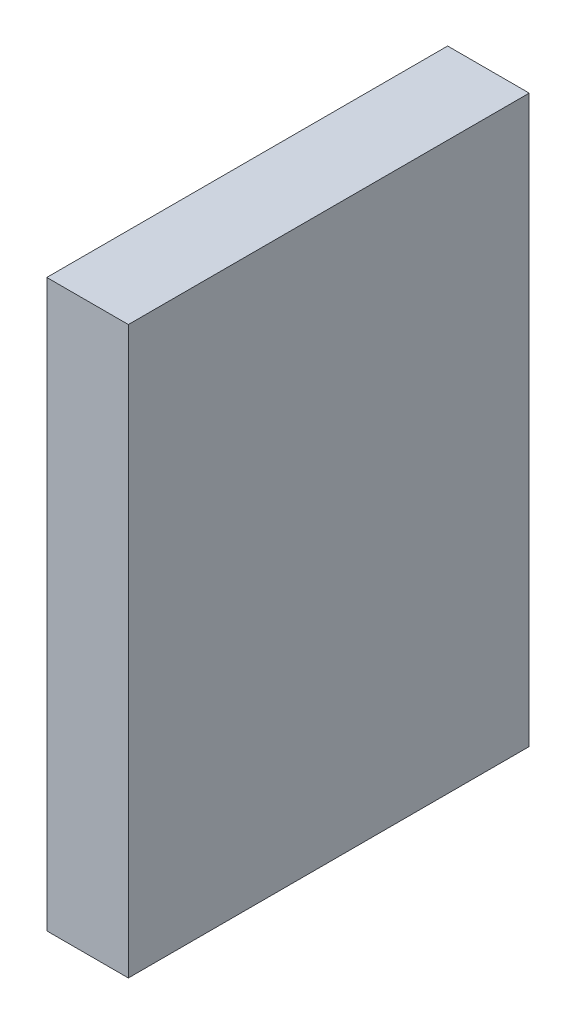
ISO-10303-21;
HEADER;
FILE_DESCRIPTION(('STEP AP214'),'2;1');
FILE_NAME('part.step','',(''),(''),'','','');
FILE_SCHEMA(('AUTOMOTIVE_DESIGN { 1 0 10303 214 1 1 1 1 }'));
ENDSEC;
DATA;
#1=APPLICATION_CONTEXT('core data for automotive mechanical design processes');
#2=APPLICATION_PROTOCOL_DEFINITION('international standard','automotive_design',2000,#1);
#3=PRODUCT_CONTEXT('',#1,'mechanical');
#4=PRODUCT('Part','Part','',(#3));
#5=PRODUCT_RELATED_PRODUCT_CATEGORY('part','',(#4));
#6=PRODUCT_DEFINITION_FORMATION('','',#4);
#7=PRODUCT_DEFINITION_CONTEXT('part definition',#1,'design');
#8=PRODUCT_DEFINITION('design','',#6,#7);
#9=PRODUCT_DEFINITION_SHAPE('','',#8);
#10=(LENGTH_UNIT() NAMED_UNIT(*) SI_UNIT(.MILLI.,.METRE.));
#11=(NAMED_UNIT(*) PLANE_ANGLE_UNIT() SI_UNIT($,.RADIAN.));
#12=(NAMED_UNIT(*) SI_UNIT($,.STERADIAN.) SOLID_ANGLE_UNIT());
#13=UNCERTAINTY_MEASURE_WITH_UNIT(LENGTH_MEASURE(1.E-05),#10,'distance_accuracy_value','');
#14=(GEOMETRIC_REPRESENTATION_CONTEXT(3) GLOBAL_UNCERTAINTY_ASSIGNED_CONTEXT((#13)) GLOBAL_UNIT_ASSIGNED_CONTEXT((#10,
#11,#12)) REPRESENTATION_CONTEXT('',''));
#15=CARTESIAN_POINT('',(0.,0.,0.));
#16=DIRECTION('',(0.,0.,1.));
#17=DIRECTION('',(1.,0.,0.));
#18=AXIS2_PLACEMENT_3D('',#15,#16,#17);
#19=CARTESIAN_POINT('',(43.942,186.055,101.144456521739));
#20=DIRECTION('',(0.,0.,-1.));
#21=DIRECTION('',(0.,1.,0.));
#22=AXIS2_PLACEMENT_3D('',#19,#20,#21);
#23=PLANE('',#22);
#24=DIRECTION('',(0.,-1.,0.));
#25=VECTOR('',#24,1.);
#26=CARTESIAN_POINT('',(0.,186.055,101.144456521739));
#27=LINE('',#26,#25);
#28=CARTESIAN_POINT('',(0.,186.055,101.144456521739));
#29=VERTEX_POINT('',#28);
#30=CARTESIAN_POINT('',(0.,-118.745,101.144456521739));
#31=VERTEX_POINT('',#30);
#32=EDGE_CURVE('E107',#29,#31,#27,.T.);
#33=ORIENTED_EDGE('',*,*,#32,.T.);
#34=DIRECTION('',(-1.,0.,0.));
#35=VECTOR('',#34,1.);
#36=CARTESIAN_POINT('',(43.942,-118.745,101.144456521739));
#37=LINE('',#36,#35);
#38=CARTESIAN_POINT('',(43.942,-118.745,101.144456521739));
#39=VERTEX_POINT('',#38);
#40=EDGE_CURVE('E11',#39,#31,#37,.T.);
#41=ORIENTED_EDGE('',*,*,#40,.F.);
#42=DIRECTION('',(0.,-1.,0.));
#43=VECTOR('',#42,1.);
#44=CARTESIAN_POINT('',(43.942,186.055,101.144456521739));
#45=LINE('',#44,#43);
#46=CARTESIAN_POINT('',(43.942,186.055,101.144456521739));
#47=VERTEX_POINT('',#46);
#48=EDGE_CURVE('E91',#47,#39,#45,.T.);
#49=ORIENTED_EDGE('',*,*,#48,.F.);
#50=DIRECTION('',(-1.,0.,0.));
#51=VECTOR('',#50,1.);
#52=CARTESIAN_POINT('',(43.942,186.055,101.144456521739));
#53=LINE('',#52,#51);
#54=EDGE_CURVE('E103',#47,#29,#53,.T.);
#55=ORIENTED_EDGE('',*,*,#54,.T.);
#56=EDGE_LOOP('',(#33,#41,#49,#55));
#57=FACE_BOUND('',#56,.T.);
#58=ADVANCED_FACE('F39',(#57),#23,.F.);
#59=CARTESIAN_POINT('',(43.942,-118.745,101.144456521739));
#60=DIRECTION('',(0.,1.,0.));
#61=DIRECTION('',(0.,0.,1.));
#62=AXIS2_PLACEMENT_3D('',#59,#60,#61);
#63=PLANE('',#62);
#64=DIRECTION('',(0.,0.,-1.));
#65=VECTOR('',#64,1.);
#66=CARTESIAN_POINT('',(0.,-118.745,101.144456521739));
#67=LINE('',#66,#65);
#68=CARTESIAN_POINT('',(0.,-118.745,-114.755543478261));
#69=VERTEX_POINT('',#68);
#70=EDGE_CURVE('E96',#31,#69,#67,.T.);
#71=ORIENTED_EDGE('',*,*,#70,.T.);
#72=DIRECTION('',(-1.,0.,0.));
#73=VECTOR('',#72,1.);
#74=CARTESIAN_POINT('',(43.942,-118.745,-114.755543478261));
#75=LINE('',#74,#73);
#76=CARTESIAN_POINT('',(43.942,-118.745,-114.755543478261));
#77=VERTEX_POINT('',#76);
#78=EDGE_CURVE('E48',#77,#69,#75,.T.);
#79=ORIENTED_EDGE('',*,*,#78,.F.);
#80=DIRECTION('',(0.,0.,-1.));
#81=VECTOR('',#80,1.);
#82=CARTESIAN_POINT('',(43.942,-118.745,101.144456521739));
#83=LINE('',#82,#81);
#84=EDGE_CURVE('E86',#39,#77,#83,.T.);
#85=ORIENTED_EDGE('',*,*,#84,.F.);
#86=ORIENTED_EDGE('',*,*,#40,.T.);
#87=EDGE_LOOP('',(#71,#79,#85,#86));
#88=FACE_BOUND('',#87,.T.);
#89=ADVANCED_FACE('F95',(#88),#63,.F.);
#90=CARTESIAN_POINT('',(43.942,186.055,-114.755543478261));
#91=DIRECTION('',(0.,0.,1.));
#92=DIRECTION('',(0.,-1.,0.));
#93=AXIS2_PLACEMENT_3D('',#90,#91,#92);
#94=PLANE('',#93);
#95=DIRECTION('',(0.,1.,0.));
#96=VECTOR('',#95,1.);
#97=CARTESIAN_POINT('',(0.,186.055,-114.755543478261));
#98=LINE('',#97,#96);
#99=CARTESIAN_POINT('',(0.,186.055,-114.755543478261));
#100=VERTEX_POINT('',#99);
#101=EDGE_CURVE('E73',#69,#100,#98,.T.);
#102=ORIENTED_EDGE('',*,*,#101,.T.);
#103=DIRECTION('',(-1.,0.,0.));
#104=VECTOR('',#103,1.);
#105=CARTESIAN_POINT('',(43.942,186.055,-114.755543478261));
#106=LINE('',#105,#104);
#107=CARTESIAN_POINT('',(43.942,186.055,-114.755543478261));
#108=VERTEX_POINT('',#107);
#109=EDGE_CURVE('E98',#108,#100,#106,.T.);
#110=ORIENTED_EDGE('',*,*,#109,.F.);
#111=DIRECTION('',(0.,1.,0.));
#112=VECTOR('',#111,1.);
#113=CARTESIAN_POINT('',(43.942,186.055,-114.755543478261));
#114=LINE('',#113,#112);
#115=EDGE_CURVE('E89',#77,#108,#114,.T.);
#116=ORIENTED_EDGE('',*,*,#115,.F.);
#117=ORIENTED_EDGE('',*,*,#78,.T.);
#118=EDGE_LOOP('',(#102,#110,#116,#117));
#119=FACE_BOUND('',#118,.T.);
#120=ADVANCED_FACE('F99',(#119),#94,.F.);
#121=CARTESIAN_POINT('',(43.942,186.055,101.144456521739));
#122=DIRECTION('',(0.,-1.,0.));
#123=DIRECTION('',(0.,0.,-1.));
#124=AXIS2_PLACEMENT_3D('',#121,#122,#123);
#125=PLANE('',#124);
#126=DIRECTION('',(0.,0.,1.));
#127=VECTOR('',#126,1.);
#128=CARTESIAN_POINT('',(0.,186.055,101.144456521739));
#129=LINE('',#128,#127);
#130=EDGE_CURVE('E79',#100,#29,#129,.T.);
#131=ORIENTED_EDGE('',*,*,#130,.T.);
#132=ORIENTED_EDGE('',*,*,#54,.F.);
#133=DIRECTION('',(0.,0.,1.));
#134=VECTOR('',#133,1.);
#135=CARTESIAN_POINT('',(43.942,186.055,101.144456521739));
#136=LINE('',#135,#134);
#137=EDGE_CURVE('E56',#108,#47,#136,.T.);
#138=ORIENTED_EDGE('',*,*,#137,.F.);
#139=ORIENTED_EDGE('',*,*,#109,.T.);
#140=EDGE_LOOP('',(#131,#132,#138,#139));
#141=FACE_BOUND('',#140,.T.);
#142=ADVANCED_FACE('F120',(#141),#125,.F.);
#143=CARTESIAN_POINT('',(43.942,0.,0.));
#144=DIRECTION('',(1.,0.,0.));
#145=DIRECTION('',(0.,0.,-1.));
#146=AXIS2_PLACEMENT_3D('',#143,#144,#145);
#147=PLANE('',#146);
#148=ORIENTED_EDGE('',*,*,#48,.T.);
#149=ORIENTED_EDGE('',*,*,#84,.T.);
#150=ORIENTED_EDGE('',*,*,#115,.T.);
#151=ORIENTED_EDGE('',*,*,#137,.T.);
#152=EDGE_LOOP('',(#148,#149,#150,#151));
#153=FACE_BOUND('',#152,.T.);
#154=ADVANCED_FACE('F87',(#153),#147,.T.);
#155=CARTESIAN_POINT('',(0.,0.,0.));
#156=DIRECTION('',(1.,0.,0.));
#157=DIRECTION('',(0.,0.,-1.));
#158=AXIS2_PLACEMENT_3D('',#155,#156,#157);
#159=PLANE('',#158);
#160=ORIENTED_EDGE('',*,*,#32,.F.);
#161=ORIENTED_EDGE('',*,*,#130,.F.);
#162=ORIENTED_EDGE('',*,*,#101,.F.);
#163=ORIENTED_EDGE('',*,*,#70,.F.);
#164=EDGE_LOOP('',(#160,#161,#162,#163));
#165=FACE_BOUND('',#164,.T.);
#166=ADVANCED_FACE('F123',(#165),#159,.F.);
#167=CLOSED_SHELL('',(#58,#89,#120,#142,#154,#166));
#168=MANIFOLD_SOLID_BREP('B2',#167);
#169=ADVANCED_BREP_SHAPE_REPRESENTATION('',(#18,#168),#14);
#170=SHAPE_DEFINITION_REPRESENTATION(#9,#169);
ENDSEC;
END-ISO-10303-21;
